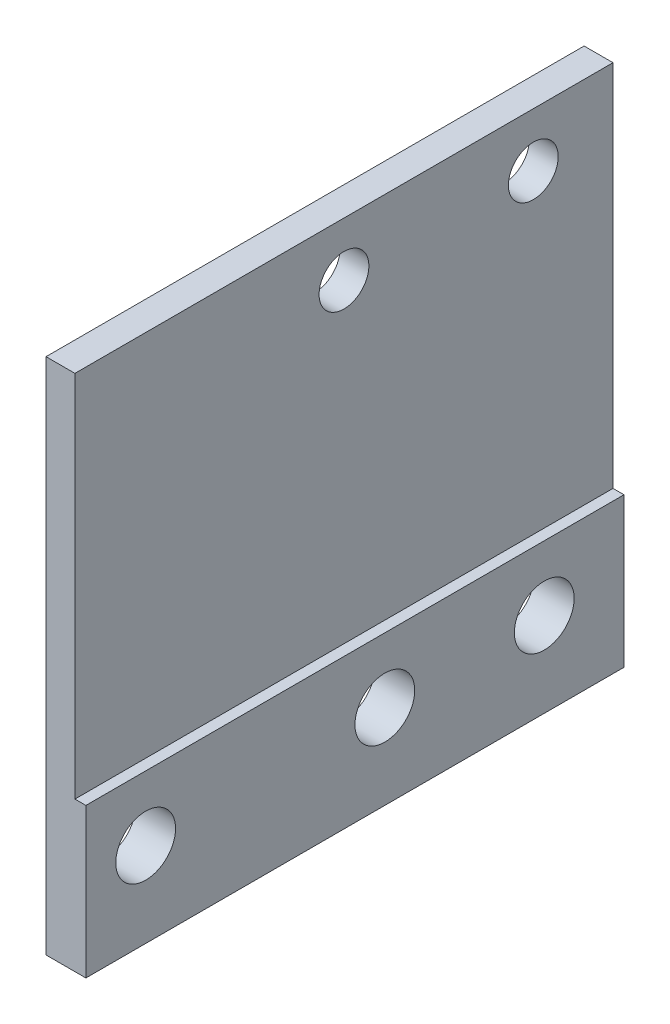
ISO-10303-21;
HEADER;
FILE_DESCRIPTION(('STEP AP214'),'2;1');
FILE_NAME('part.step','',(''),(''),'','','');
FILE_SCHEMA(('AUTOMOTIVE_DESIGN { 1 0 10303 214 1 1 1 1 }'));
ENDSEC;
DATA;
#1=APPLICATION_CONTEXT('core data for automotive mechanical design processes');
#2=APPLICATION_PROTOCOL_DEFINITION('international standard','automotive_design',2000,#1);
#3=PRODUCT_CONTEXT('',#1,'mechanical');
#4=PRODUCT('Part','Part','',(#3));
#5=PRODUCT_RELATED_PRODUCT_CATEGORY('part','',(#4));
#6=PRODUCT_DEFINITION_FORMATION('','',#4);
#7=PRODUCT_DEFINITION_CONTEXT('part definition',#1,'design');
#8=PRODUCT_DEFINITION('design','',#6,#7);
#9=PRODUCT_DEFINITION_SHAPE('','',#8);
#10=(LENGTH_UNIT() NAMED_UNIT(*) SI_UNIT(.MILLI.,.METRE.));
#11=(NAMED_UNIT(*) PLANE_ANGLE_UNIT() SI_UNIT($,.RADIAN.));
#12=(NAMED_UNIT(*) SI_UNIT($,.STERADIAN.) SOLID_ANGLE_UNIT());
#13=UNCERTAINTY_MEASURE_WITH_UNIT(LENGTH_MEASURE(1.E-05),#10,'distance_accuracy_value','');
#14=(GEOMETRIC_REPRESENTATION_CONTEXT(3) GLOBAL_UNCERTAINTY_ASSIGNED_CONTEXT((#13)) GLOBAL_UNIT_ASSIGNED_CONTEXT((#10,
#11,#12)) REPRESENTATION_CONTEXT('',''));
#15=CARTESIAN_POINT('',(0.,0.,0.));
#16=DIRECTION('',(0.,0.,1.));
#17=DIRECTION('',(1.,0.,0.));
#18=AXIS2_PLACEMENT_3D('',#15,#16,#17);
#19=CARTESIAN_POINT('',(0.,7.5,-5.));
#20=DIRECTION('',(-1.,0.,0.));
#21=DIRECTION('',(0.,0.,1.));
#22=AXIS2_PLACEMENT_3D('',#19,#20,#21);
#23=PLANE('',#22);
#24=CARTESIAN_POINT('',(0.,23.2972038265252,-1.00000000000001));
#25=DIRECTION('',(1.,0.,0.));
#26=DIRECTION('',(0.,0.,-1.));
#27=AXIS2_PLACEMENT_3D('',#24,#25,#26);
#28=CIRCLE('',#27,1.25);
#29=CARTESIAN_POINT('',(0.,23.2972038265252,-2.25000000000001));
#30=VERTEX_POINT('',#29);
#31=EDGE_CURVE('E195',#30,#30,#28,.T.);
#32=ORIENTED_EDGE('',*,*,#31,.T.);
#33=EDGE_LOOP('',(#32));
#34=FACE_BOUND('',#33,.T.);
#35=CARTESIAN_POINT('',(0.,23.2972038265252,8.49999999999999));
#36=DIRECTION('',(1.,0.,0.));
#37=DIRECTION('',(0.,0.,-1.));
#38=AXIS2_PLACEMENT_3D('',#35,#36,#37);
#39=CIRCLE('',#38,1.25);
#40=CARTESIAN_POINT('',(0.,23.2972038265252,7.24999999999999));
#41=VERTEX_POINT('',#40);
#42=EDGE_CURVE('E189',#41,#41,#39,.T.);
#43=ORIENTED_EDGE('',*,*,#42,.T.);
#44=EDGE_LOOP('',(#43));
#45=FACE_BOUND('',#44,.T.);
#46=CARTESIAN_POINT('',(0.,4.24999999999948,7.));
#47=DIRECTION('',(1.,0.,0.));
#48=DIRECTION('',(0.,0.,-1.));
#49=AXIS2_PLACEMENT_3D('',#46,#47,#48);
#50=CIRCLE('',#49,1.5);
#51=CARTESIAN_POINT('',(0.,4.24999999999948,5.5));
#52=VERTEX_POINT('',#51);
#53=EDGE_CURVE('E185',#52,#52,#50,.T.);
#54=ORIENTED_EDGE('',*,*,#53,.T.);
#55=EDGE_LOOP('',(#54));
#56=FACE_BOUND('',#55,.T.);
#57=CARTESIAN_POINT('',(0.,4.24999999999948,19.));
#58=DIRECTION('',(1.,0.,0.));
#59=DIRECTION('',(0.,0.,-1.));
#60=AXIS2_PLACEMENT_3D('',#57,#58,#59);
#61=CIRCLE('',#60,1.5);
#62=CARTESIAN_POINT('',(0.,4.24999999999948,17.5));
#63=VERTEX_POINT('',#62);
#64=EDGE_CURVE('E180',#63,#63,#61,.T.);
#65=ORIENTED_EDGE('',*,*,#64,.T.);
#66=EDGE_LOOP('',(#65));
#67=FACE_BOUND('',#66,.T.);
#68=CARTESIAN_POINT('',(0.,4.24999999999948,-0.999999999999999));
#69=DIRECTION('',(1.,0.,0.));
#70=DIRECTION('',(0.,0.,-1.));
#71=AXIS2_PLACEMENT_3D('',#68,#69,#70);
#72=CIRCLE('',#71,1.5);
#73=CARTESIAN_POINT('',(0.,4.24999999999948,-2.5));
#74=VERTEX_POINT('',#73);
#75=EDGE_CURVE('E107',#74,#74,#72,.T.);
#76=ORIENTED_EDGE('',*,*,#75,.T.);
#77=EDGE_LOOP('',(#76));
#78=FACE_BOUND('',#77,.T.);
#79=DIRECTION('',(0.,0.,1.));
#80=VECTOR('',#79,1.);
#81=CARTESIAN_POINT('',(0.,0.,-5.));
#82=LINE('',#81,#80);
#83=CARTESIAN_POINT('',(0.,0.,-5.));
#84=VERTEX_POINT('',#83);
#85=CARTESIAN_POINT('',(0.,0.,22.));
#86=VERTEX_POINT('',#85);
#87=EDGE_CURVE('E39',#84,#86,#82,.T.);
#88=ORIENTED_EDGE('',*,*,#87,.T.);
#89=DIRECTION('',(0.,-1.,0.));
#90=VECTOR('',#89,1.);
#91=CARTESIAN_POINT('',(0.,0.,22.));
#92=LINE('',#91,#90);
#93=CARTESIAN_POINT('',(0.,26.,22.));
#94=VERTEX_POINT('',#93);
#95=EDGE_CURVE('E91',#94,#86,#92,.T.);
#96=ORIENTED_EDGE('',*,*,#95,.F.);
#97=DIRECTION('',(0.,0.,1.));
#98=VECTOR('',#97,1.);
#99=CARTESIAN_POINT('',(0.,26.,-5.));
#100=LINE('',#99,#98);
#101=CARTESIAN_POINT('',(0.,26.,-5.));
#102=VERTEX_POINT('',#101);
#103=EDGE_CURVE('E11',#102,#94,#100,.T.);
#104=ORIENTED_EDGE('',*,*,#103,.F.);
#105=DIRECTION('',(0.,-1.,0.));
#106=VECTOR('',#105,1.);
#107=CARTESIAN_POINT('',(0.,0.,-5.));
#108=LINE('',#107,#106);
#109=EDGE_CURVE('E52',#102,#84,#108,.T.);
#110=ORIENTED_EDGE('',*,*,#109,.T.);
#111=EDGE_LOOP('',(#88,#96,#104,#110));
#112=FACE_BOUND('',#111,.T.);
#113=ADVANCED_FACE('F35',(#34,#45,#56,#67,#78,#112),#23,.T.);
#114=CARTESIAN_POINT('',(0.,26.,-5.));
#115=DIRECTION('',(0.,1.,0.));
#116=DIRECTION('',(0.,0.,1.));
#117=AXIS2_PLACEMENT_3D('',#114,#115,#116);
#118=PLANE('',#117);
#119=ORIENTED_EDGE('',*,*,#103,.T.);
#120=DIRECTION('',(-1.,0.,0.));
#121=VECTOR('',#120,1.);
#122=CARTESIAN_POINT('',(0.,26.,22.));
#123=LINE('',#122,#121);
#124=CARTESIAN_POINT('',(1.45,26.,22.));
#125=VERTEX_POINT('',#124);
#126=EDGE_CURVE('E106',#125,#94,#123,.T.);
#127=ORIENTED_EDGE('',*,*,#126,.F.);
#128=DIRECTION('',(0.,0.,1.));
#129=VECTOR('',#128,1.);
#130=CARTESIAN_POINT('',(1.45,26.,-5.));
#131=LINE('',#130,#129);
#132=CARTESIAN_POINT('',(1.45,26.,-5.));
#133=VERTEX_POINT('',#132);
#134=EDGE_CURVE('E44',#133,#125,#131,.T.);
#135=ORIENTED_EDGE('',*,*,#134,.F.);
#136=DIRECTION('',(-1.,0.,0.));
#137=VECTOR('',#136,1.);
#138=CARTESIAN_POINT('',(0.,26.,-5.));
#139=LINE('',#138,#137);
#140=EDGE_CURVE('E96',#133,#102,#139,.T.);
#141=ORIENTED_EDGE('',*,*,#140,.T.);
#142=EDGE_LOOP('',(#119,#127,#135,#141));
#143=FACE_BOUND('',#142,.T.);
#144=ADVANCED_FACE('F150',(#143),#118,.T.);
#145=CARTESIAN_POINT('',(1.45,7.5,-5.));
#146=DIRECTION('',(1.,0.,0.));
#147=DIRECTION('',(0.,0.,-1.));
#148=AXIS2_PLACEMENT_3D('',#145,#146,#147);
#149=PLANE('',#148);
#150=CARTESIAN_POINT('',(1.45,23.2972038265252,-1.00000000000001));
#151=DIRECTION('',(1.,0.,0.));
#152=DIRECTION('',(0.,0.,-1.));
#153=AXIS2_PLACEMENT_3D('',#150,#151,#152);
#154=CIRCLE('',#153,1.24999999999999);
#155=CARTESIAN_POINT('',(1.45,23.2972038265252,-2.25));
#156=VERTEX_POINT('',#155);
#157=EDGE_CURVE('E198',#156,#156,#154,.T.);
#158=ORIENTED_EDGE('',*,*,#157,.F.);
#159=EDGE_LOOP('',(#158));
#160=FACE_BOUND('',#159,.T.);
#161=CARTESIAN_POINT('',(1.45,23.2972038265252,8.49999999999999));
#162=DIRECTION('',(1.,0.,0.));
#163=DIRECTION('',(0.,0.,-1.));
#164=AXIS2_PLACEMENT_3D('',#161,#162,#163);
#165=CIRCLE('',#164,1.24999999999999);
#166=CARTESIAN_POINT('',(1.45,23.2972038265252,7.25));
#167=VERTEX_POINT('',#166);
#168=EDGE_CURVE('E192',#167,#167,#165,.T.);
#169=ORIENTED_EDGE('',*,*,#168,.F.);
#170=EDGE_LOOP('',(#169));
#171=FACE_BOUND('',#170,.T.);
#172=ORIENTED_EDGE('',*,*,#134,.T.);
#173=DIRECTION('',(0.,1.,0.));
#174=VECTOR('',#173,1.);
#175=CARTESIAN_POINT('',(1.45,7.5,22.));
#176=LINE('',#175,#174);
#177=CARTESIAN_POINT('',(1.45,7.5,22.));
#178=VERTEX_POINT('',#177);
#179=EDGE_CURVE('E118',#178,#125,#176,.T.);
#180=ORIENTED_EDGE('',*,*,#179,.F.);
#181=DIRECTION('',(0.,0.,1.));
#182=VECTOR('',#181,1.);
#183=CARTESIAN_POINT('',(1.45,7.5,-5.));
#184=LINE('',#183,#182);
#185=CARTESIAN_POINT('',(1.45,7.5,-5.));
#186=VERTEX_POINT('',#185);
#187=EDGE_CURVE('E135',#186,#178,#184,.T.);
#188=ORIENTED_EDGE('',*,*,#187,.F.);
#189=DIRECTION('',(0.,1.,0.));
#190=VECTOR('',#189,1.);
#191=CARTESIAN_POINT('',(1.45,7.5,-5.));
#192=LINE('',#191,#190);
#193=EDGE_CURVE('E130',#186,#133,#192,.T.);
#194=ORIENTED_EDGE('',*,*,#193,.T.);
#195=EDGE_LOOP('',(#172,#180,#188,#194));
#196=FACE_BOUND('',#195,.T.);
#197=ADVANCED_FACE('F148',(#160,#171,#196),#149,.T.);
#198=CARTESIAN_POINT('',(1.45,7.5,-5.));
#199=DIRECTION('',(0.,1.,0.));
#200=DIRECTION('',(0.,0.,1.));
#201=AXIS2_PLACEMENT_3D('',#198,#199,#200);
#202=PLANE('',#201);
#203=ORIENTED_EDGE('',*,*,#187,.T.);
#204=DIRECTION('',(-1.,0.,0.));
#205=VECTOR('',#204,1.);
#206=CARTESIAN_POINT('',(1.45,7.5,22.));
#207=LINE('',#206,#205);
#208=CARTESIAN_POINT('',(2.,7.5,22.));
#209=VERTEX_POINT('',#208);
#210=EDGE_CURVE('E115',#209,#178,#207,.T.);
#211=ORIENTED_EDGE('',*,*,#210,.F.);
#212=DIRECTION('',(0.,0.,1.));
#213=VECTOR('',#212,1.);
#214=CARTESIAN_POINT('',(2.,7.5,-5.));
#215=LINE('',#214,#213);
#216=CARTESIAN_POINT('',(2.,7.5,-5.));
#217=VERTEX_POINT('',#216);
#218=EDGE_CURVE('E137',#217,#209,#215,.T.);
#219=ORIENTED_EDGE('',*,*,#218,.F.);
#220=DIRECTION('',(-1.,0.,0.));
#221=VECTOR('',#220,1.);
#222=CARTESIAN_POINT('',(1.45,7.5,-5.));
#223=LINE('',#222,#221);
#224=EDGE_CURVE('E127',#217,#186,#223,.T.);
#225=ORIENTED_EDGE('',*,*,#224,.T.);
#226=EDGE_LOOP('',(#203,#211,#219,#225));
#227=FACE_BOUND('',#226,.T.);
#228=ADVANCED_FACE('F145',(#227),#202,.T.);
#229=CARTESIAN_POINT('',(2.,0.,-5.));
#230=DIRECTION('',(1.,0.,0.));
#231=DIRECTION('',(0.,0.,-1.));
#232=AXIS2_PLACEMENT_3D('',#229,#230,#231);
#233=PLANE('',#232);
#234=CARTESIAN_POINT('',(2.,4.24999999999948,7.));
#235=DIRECTION('',(1.,0.,0.));
#236=DIRECTION('',(0.,0.,-1.));
#237=AXIS2_PLACEMENT_3D('',#234,#235,#236);
#238=CIRCLE('',#237,1.5);
#239=CARTESIAN_POINT('',(2.,4.24999999999948,5.5));
#240=VERTEX_POINT('',#239);
#241=EDGE_CURVE('E172',#240,#240,#238,.T.);
#242=ORIENTED_EDGE('',*,*,#241,.F.);
#243=EDGE_LOOP('',(#242));
#244=FACE_BOUND('',#243,.T.);
#245=CARTESIAN_POINT('',(2.,4.24999999999948,19.));
#246=DIRECTION('',(1.,0.,0.));
#247=DIRECTION('',(0.,0.,-1.));
#248=AXIS2_PLACEMENT_3D('',#245,#246,#247);
#249=CIRCLE('',#248,1.5);
#250=CARTESIAN_POINT('',(2.,4.24999999999948,17.5));
#251=VERTEX_POINT('',#250);
#252=EDGE_CURVE('E176',#251,#251,#249,.T.);
#253=ORIENTED_EDGE('',*,*,#252,.F.);
#254=EDGE_LOOP('',(#253));
#255=FACE_BOUND('',#254,.T.);
#256=CARTESIAN_POINT('',(2.,4.24999999999948,-0.999999999999999));
#257=DIRECTION('',(1.,0.,0.));
#258=DIRECTION('',(0.,0.,-1.));
#259=AXIS2_PLACEMENT_3D('',#256,#257,#258);
#260=CIRCLE('',#259,1.5);
#261=CARTESIAN_POINT('',(2.,4.24999999999948,-2.5));
#262=VERTEX_POINT('',#261);
#263=EDGE_CURVE('E110',#262,#262,#260,.T.);
#264=ORIENTED_EDGE('',*,*,#263,.F.);
#265=EDGE_LOOP('',(#264));
#266=FACE_BOUND('',#265,.T.);
#267=ORIENTED_EDGE('',*,*,#218,.T.);
#268=DIRECTION('',(0.,1.,0.));
#269=VECTOR('',#268,1.);
#270=CARTESIAN_POINT('',(2.,0.,22.));
#271=LINE('',#270,#269);
#272=CARTESIAN_POINT('',(2.,0.,22.));
#273=VERTEX_POINT('',#272);
#274=EDGE_CURVE('E102',#273,#209,#271,.T.);
#275=ORIENTED_EDGE('',*,*,#274,.F.);
#276=DIRECTION('',(0.,0.,1.));
#277=VECTOR('',#276,1.);
#278=CARTESIAN_POINT('',(2.,0.,-5.));
#279=LINE('',#278,#277);
#280=CARTESIAN_POINT('',(2.,0.,-5.));
#281=VERTEX_POINT('',#280);
#282=EDGE_CURVE('E95',#281,#273,#279,.T.);
#283=ORIENTED_EDGE('',*,*,#282,.F.);
#284=DIRECTION('',(0.,1.,0.));
#285=VECTOR('',#284,1.);
#286=CARTESIAN_POINT('',(2.,0.,-5.));
#287=LINE('',#286,#285);
#288=EDGE_CURVE('E124',#281,#217,#287,.T.);
#289=ORIENTED_EDGE('',*,*,#288,.T.);
#290=EDGE_LOOP('',(#267,#275,#283,#289));
#291=FACE_BOUND('',#290,.T.);
#292=ADVANCED_FACE('F139',(#244,#255,#266,#291),#233,.T.);
#293=CARTESIAN_POINT('',(0.,0.,-5.));
#294=DIRECTION('',(0.,-1.,0.));
#295=DIRECTION('',(0.,0.,-1.));
#296=AXIS2_PLACEMENT_3D('',#293,#294,#295);
#297=PLANE('',#296);
#298=ORIENTED_EDGE('',*,*,#282,.T.);
#299=DIRECTION('',(1.,0.,0.));
#300=VECTOR('',#299,1.);
#301=CARTESIAN_POINT('',(0.,0.,22.));
#302=LINE('',#301,#300);
#303=EDGE_CURVE('E98',#86,#273,#302,.T.);
#304=ORIENTED_EDGE('',*,*,#303,.F.);
#305=ORIENTED_EDGE('',*,*,#87,.F.);
#306=DIRECTION('',(1.,0.,0.));
#307=VECTOR('',#306,1.);
#308=CARTESIAN_POINT('',(0.,0.,-5.));
#309=LINE('',#308,#307);
#310=EDGE_CURVE('E122',#84,#281,#309,.T.);
#311=ORIENTED_EDGE('',*,*,#310,.T.);
#312=EDGE_LOOP('',(#298,#304,#305,#311));
#313=FACE_BOUND('',#312,.T.);
#314=ADVANCED_FACE('F37',(#313),#297,.T.);
#315=CARTESIAN_POINT('',(0.,0.,-5.));
#316=DIRECTION('',(0.,0.,-1.));
#317=DIRECTION('',(-1.,0.,0.));
#318=AXIS2_PLACEMENT_3D('',#315,#316,#317);
#319=PLANE('',#318);
#320=ORIENTED_EDGE('',*,*,#109,.F.);
#321=ORIENTED_EDGE('',*,*,#140,.F.);
#322=ORIENTED_EDGE('',*,*,#193,.F.);
#323=ORIENTED_EDGE('',*,*,#224,.F.);
#324=ORIENTED_EDGE('',*,*,#288,.F.);
#325=ORIENTED_EDGE('',*,*,#310,.F.);
#326=EDGE_LOOP('',(#320,#321,#322,#323,#324,#325));
#327=FACE_BOUND('',#326,.T.);
#328=ADVANCED_FACE('F149',(#327),#319,.T.);
#329=CARTESIAN_POINT('',(0.,0.,22.));
#330=DIRECTION('',(0.,0.,-1.));
#331=DIRECTION('',(-1.,0.,0.));
#332=AXIS2_PLACEMENT_3D('',#329,#330,#331);
#333=PLANE('',#332);
#334=ORIENTED_EDGE('',*,*,#95,.T.);
#335=ORIENTED_EDGE('',*,*,#303,.T.);
#336=ORIENTED_EDGE('',*,*,#274,.T.);
#337=ORIENTED_EDGE('',*,*,#210,.T.);
#338=ORIENTED_EDGE('',*,*,#179,.T.);
#339=ORIENTED_EDGE('',*,*,#126,.T.);
#340=EDGE_LOOP('',(#334,#335,#336,#337,#338,#339));
#341=FACE_BOUND('',#340,.T.);
#342=ADVANCED_FACE('F104',(#341),#333,.F.);
#343=CARTESIAN_POINT('',(2.,4.24999999999948,-0.999999999999999));
#344=DIRECTION('',(1.,0.,0.));
#345=DIRECTION('',(0.,0.,-1.));
#346=AXIS2_PLACEMENT_3D('',#343,#344,#345);
#347=CYLINDRICAL_SURFACE('',#346,1.5);
#348=ORIENTED_EDGE('',*,*,#75,.F.);
#349=EDGE_LOOP('',(#348));
#350=FACE_BOUND('',#349,.T.);
#351=ORIENTED_EDGE('',*,*,#263,.T.);
#352=EDGE_LOOP('',(#351));
#353=FACE_BOUND('',#352,.T.);
#354=ADVANCED_FACE('F224',(#350,#353),#347,.F.);
#355=CARTESIAN_POINT('',(2.,4.24999999999948,19.));
#356=DIRECTION('',(1.,0.,0.));
#357=DIRECTION('',(0.,0.,-1.));
#358=AXIS2_PLACEMENT_3D('',#355,#356,#357);
#359=CYLINDRICAL_SURFACE('',#358,1.5);
#360=ORIENTED_EDGE('',*,*,#64,.F.);
#361=EDGE_LOOP('',(#360));
#362=FACE_BOUND('',#361,.T.);
#363=ORIENTED_EDGE('',*,*,#252,.T.);
#364=EDGE_LOOP('',(#363));
#365=FACE_BOUND('',#364,.T.);
#366=ADVANCED_FACE('F217',(#362,#365),#359,.F.);
#367=CARTESIAN_POINT('',(2.,4.24999999999948,7.));
#368=DIRECTION('',(1.,0.,0.));
#369=DIRECTION('',(0.,0.,-1.));
#370=AXIS2_PLACEMENT_3D('',#367,#368,#369);
#371=CYLINDRICAL_SURFACE('',#370,1.5);
#372=ORIENTED_EDGE('',*,*,#53,.F.);
#373=EDGE_LOOP('',(#372));
#374=FACE_BOUND('',#373,.T.);
#375=ORIENTED_EDGE('',*,*,#241,.T.);
#376=EDGE_LOOP('',(#375));
#377=FACE_BOUND('',#376,.T.);
#378=ADVANCED_FACE('F208',(#374,#377),#371,.F.);
#379=CARTESIAN_POINT('',(1.45,23.2972038265252,8.49999999999999));
#380=DIRECTION('',(1.,0.,0.));
#381=DIRECTION('',(0.,0.,-1.));
#382=AXIS2_PLACEMENT_3D('',#379,#380,#381);
#383=CYLINDRICAL_SURFACE('',#382,1.24999999999999);
#384=ORIENTED_EDGE('',*,*,#42,.F.);
#385=EDGE_LOOP('',(#384));
#386=FACE_BOUND('',#385,.T.);
#387=ORIENTED_EDGE('',*,*,#168,.T.);
#388=EDGE_LOOP('',(#387));
#389=FACE_BOUND('',#388,.T.);
#390=ADVANCED_FACE('F206',(#386,#389),#383,.F.);
#391=CARTESIAN_POINT('',(1.45,23.2972038265252,-1.00000000000001));
#392=DIRECTION('',(1.,0.,0.));
#393=DIRECTION('',(0.,0.,-1.));
#394=AXIS2_PLACEMENT_3D('',#391,#392,#393);
#395=CYLINDRICAL_SURFACE('',#394,1.24999999999999);
#396=ORIENTED_EDGE('',*,*,#31,.F.);
#397=EDGE_LOOP('',(#396));
#398=FACE_BOUND('',#397,.T.);
#399=ORIENTED_EDGE('',*,*,#157,.T.);
#400=EDGE_LOOP('',(#399));
#401=FACE_BOUND('',#400,.T.);
#402=ADVANCED_FACE('F202',(#398,#401),#395,.F.);
#403=CLOSED_SHELL('',(#113,#144,#197,#228,#292,#314,#328,#342,#354,#366,#378,#390,#402));
#404=MANIFOLD_SOLID_BREP('B2',#403);
#405=ADVANCED_BREP_SHAPE_REPRESENTATION('',(#18,#404),#14);
#406=SHAPE_DEFINITION_REPRESENTATION(#9,#405);
ENDSEC;
END-ISO-10303-21;
